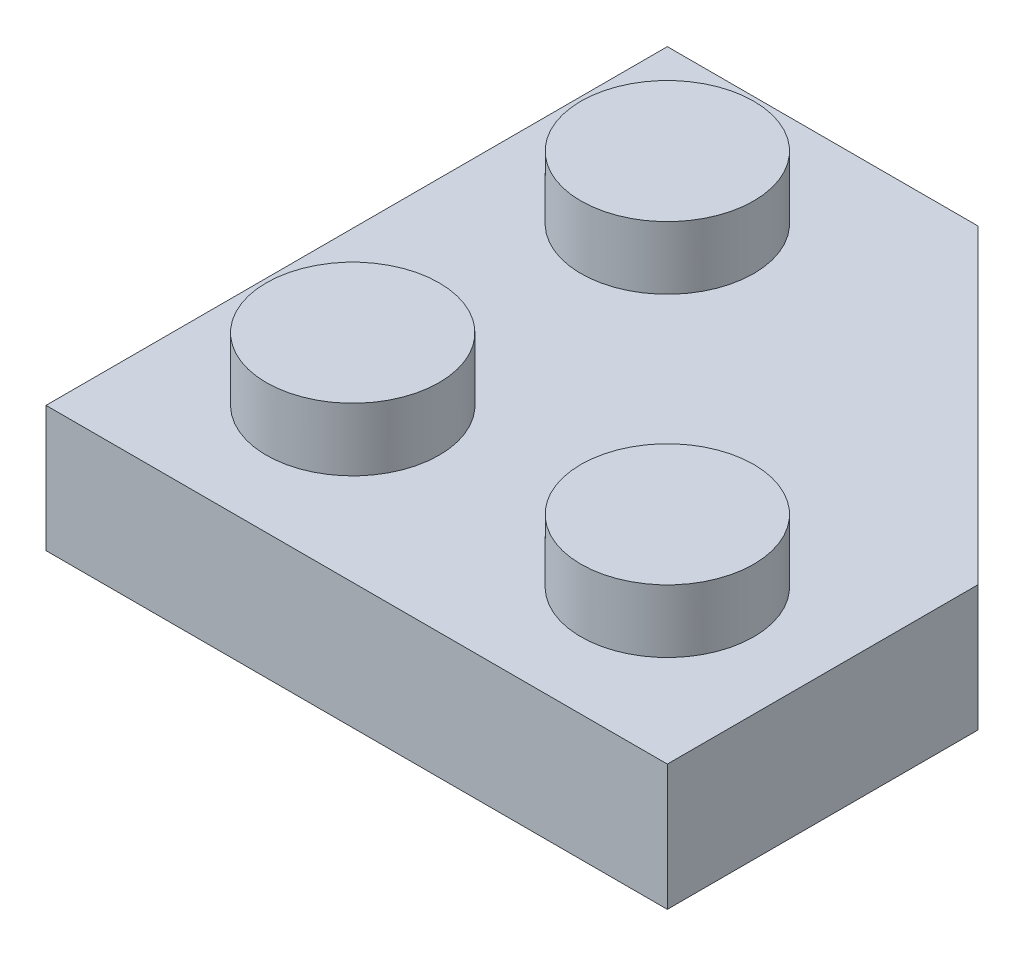
ISO-10303-21;
HEADER;
FILE_DESCRIPTION(('STEP AP214'),'2;1');
FILE_NAME('part.step','',(''),(''),'','','');
FILE_SCHEMA(('AUTOMOTIVE_DESIGN { 1 0 10303 214 1 1 1 1 }'));
ENDSEC;
DATA;
#1=APPLICATION_CONTEXT('core data for automotive mechanical design processes');
#2=APPLICATION_PROTOCOL_DEFINITION('international standard','automotive_design',2000,#1);
#3=PRODUCT_CONTEXT('',#1,'mechanical');
#4=PRODUCT('Part','Part','',(#3));
#5=PRODUCT_RELATED_PRODUCT_CATEGORY('part','',(#4));
#6=PRODUCT_DEFINITION_FORMATION('','',#4);
#7=PRODUCT_DEFINITION_CONTEXT('part definition',#1,'design');
#8=PRODUCT_DEFINITION('design','',#6,#7);
#9=PRODUCT_DEFINITION_SHAPE('','',#8);
#10=(LENGTH_UNIT() NAMED_UNIT(*) SI_UNIT(.MILLI.,.METRE.));
#11=(NAMED_UNIT(*) PLANE_ANGLE_UNIT() SI_UNIT($,.RADIAN.));
#12=(NAMED_UNIT(*) SI_UNIT($,.STERADIAN.) SOLID_ANGLE_UNIT());
#13=UNCERTAINTY_MEASURE_WITH_UNIT(LENGTH_MEASURE(1.E-05),#10,'distance_accuracy_value','');
#14=(GEOMETRIC_REPRESENTATION_CONTEXT(3) GLOBAL_UNCERTAINTY_ASSIGNED_CONTEXT((#13)) GLOBAL_UNIT_ASSIGNED_CONTEXT((#10,
#11,#12)) REPRESENTATION_CONTEXT('',''));
#15=CARTESIAN_POINT('',(0.,0.,0.));
#16=DIRECTION('',(0.,0.,1.));
#17=DIRECTION('',(1.,0.,0.));
#18=AXIS2_PLACEMENT_3D('',#15,#16,#17);
#19=CARTESIAN_POINT('',(-12.4847290640394,0.,7.9));
#20=DIRECTION('',(0.,1.,0.));
#21=DIRECTION('',(0.,0.,1.));
#22=AXIS2_PLACEMENT_3D('',#19,#20,#21);
#23=PLANE('',#22);
#24=DIRECTION('',(1.,0.,0.));
#25=VECTOR('',#24,1.);
#26=CARTESIAN_POINT('',(-12.4847290640394,0.,-7.9));
#27=LINE('',#26,#25);
#28=CARTESIAN_POINT('',(-12.4847290640394,0.,-7.9));
#29=VERTEX_POINT('',#28);
#30=CARTESIAN_POINT('',(-4.58472906403942,0.,-7.9));
#31=VERTEX_POINT('',#30);
#32=EDGE_CURVE('E417',#29,#31,#27,.T.);
#33=ORIENTED_EDGE('',*,*,#32,.T.);
#34=DIRECTION('',(0.707106781186547,0.,0.707106781186547));
#35=VECTOR('',#34,1.);
#36=CARTESIAN_POINT('',(3.31527093596058,0.,0.));
#37=LINE('',#36,#35);
#38=CARTESIAN_POINT('',(-3.38472906403942,0.,-6.7));
#39=VERTEX_POINT('',#38);
#40=EDGE_CURVE('E142',#31,#39,#37,.T.);
#41=ORIENTED_EDGE('',*,*,#40,.T.);
#42=DIRECTION('',(1.,0.,0.));
#43=VECTOR('',#42,1.);
#44=CARTESIAN_POINT('',(-12.4847290640394,0.,-6.7));
#45=LINE('',#44,#43);
#46=CARTESIAN_POINT('',(-11.2847290640394,0.,-6.7));
#47=VERTEX_POINT('',#46);
#48=EDGE_CURVE('E442',#47,#39,#45,.T.);
#49=ORIENTED_EDGE('',*,*,#48,.F.);
#50=DIRECTION('',(0.,0.,-1.));
#51=VECTOR('',#50,1.);
#52=CARTESIAN_POINT('',(-11.2847290640394,0.,7.9));
#53=LINE('',#52,#51);
#54=CARTESIAN_POINT('',(-11.2847290640394,0.,6.7));
#55=VERTEX_POINT('',#54);
#56=EDGE_CURVE('E454',#55,#47,#53,.T.);
#57=ORIENTED_EDGE('',*,*,#56,.F.);
#58=DIRECTION('',(1.,0.,0.));
#59=VECTOR('',#58,1.);
#60=CARTESIAN_POINT('',(-12.4847290640394,0.,6.7));
#61=LINE('',#60,#59);
#62=CARTESIAN_POINT('',(2.11527093596058,0.,6.7));
#63=VERTEX_POINT('',#62);
#64=EDGE_CURVE('E436',#55,#63,#61,.T.);
#65=ORIENTED_EDGE('',*,*,#64,.T.);
#66=DIRECTION('',(0.,0.,-1.));
#67=VECTOR('',#66,1.);
#68=CARTESIAN_POINT('',(2.11527093596058,0.,7.9));
#69=LINE('',#68,#67);
#70=CARTESIAN_POINT('',(2.11527093596058,0.,-1.2));
#71=VERTEX_POINT('',#70);
#72=EDGE_CURVE('E149',#63,#71,#69,.T.);
#73=ORIENTED_EDGE('',*,*,#72,.T.);
#74=CARTESIAN_POINT('',(3.31527093596058,0.,0.));
#75=VERTEX_POINT('',#74);
#76=EDGE_CURVE('E133',#71,#75,#37,.T.);
#77=ORIENTED_EDGE('',*,*,#76,.T.);
#78=DIRECTION('',(0.,0.,-1.));
#79=VECTOR('',#78,1.);
#80=CARTESIAN_POINT('',(3.31527093596058,0.,7.9));
#81=LINE('',#80,#79);
#82=CARTESIAN_POINT('',(3.31527093596058,0.,7.9));
#83=VERTEX_POINT('',#82);
#84=EDGE_CURVE('E146',#83,#75,#81,.T.);
#85=ORIENTED_EDGE('',*,*,#84,.F.);
#86=DIRECTION('',(1.,0.,0.));
#87=VECTOR('',#86,1.);
#88=CARTESIAN_POINT('',(-12.4847290640394,0.,7.9));
#89=LINE('',#88,#87);
#90=CARTESIAN_POINT('',(-12.4847290640394,0.,7.9));
#91=VERTEX_POINT('',#90);
#92=EDGE_CURVE('E90',#91,#83,#89,.T.);
#93=ORIENTED_EDGE('',*,*,#92,.F.);
#94=DIRECTION('',(0.,0.,-1.));
#95=VECTOR('',#94,1.);
#96=CARTESIAN_POINT('',(-12.4847290640394,0.,7.9));
#97=LINE('',#96,#95);
#98=EDGE_CURVE('E153',#91,#29,#97,.T.);
#99=ORIENTED_EDGE('',*,*,#98,.T.);
#100=EDGE_LOOP('',(#33,#41,#49,#57,#65,#73,#77,#85,#93,#99));
#101=FACE_BOUND('',#100,.T.);
#102=ADVANCED_FACE('F43',(#101),#23,.F.);
#103=CARTESIAN_POINT('',(-0.584729064039415,4.8,4.));
#104=DIRECTION('',(0.,1.,0.));
#105=DIRECTION('',(-1.,0.,0.));
#106=AXIS2_PLACEMENT_3D('',#103,#104,#105);
#107=PLANE('',#106);
#108=CARTESIAN_POINT('',(-0.584729064039415,4.8,4.));
#109=DIRECTION('',(0.,1.,0.));
#110=DIRECTION('',(-1.,0.,0.));
#111=AXIS2_PLACEMENT_3D('',#108,#109,#110);
#112=CIRCLE('',#111,2.19793866498286);
#113=CARTESIAN_POINT('',(-2.78266772902228,4.8,4.));
#114=VERTEX_POINT('',#113);
#115=EDGE_CURVE('E51',#114,#114,#112,.T.);
#116=ORIENTED_EDGE('',*,*,#115,.T.);
#117=EDGE_LOOP('',(#116));
#118=FACE_BOUND('',#117,.T.);
#119=ADVANCED_FACE('F45',(#118),#107,.T.);
#120=CARTESIAN_POINT('',(-0.584729064039415,4.8,4.));
#121=DIRECTION('',(0.,-1.,0.));
#122=DIRECTION('',(1.,0.,0.));
#123=AXIS2_PLACEMENT_3D('',#120,#121,#122);
#124=CYLINDRICAL_SURFACE('',#123,2.19793866498286);
#125=ORIENTED_EDGE('',*,*,#115,.F.);
#126=EDGE_LOOP('',(#125));
#127=FACE_BOUND('',#126,.T.);
#128=CARTESIAN_POINT('',(-0.584729064039415,3.2,4.));
#129=DIRECTION('',(0.,-1.,0.));
#130=DIRECTION('',(1.,0.,0.));
#131=AXIS2_PLACEMENT_3D('',#128,#129,#130);
#132=CIRCLE('',#131,2.19793866498286);
#133=CARTESIAN_POINT('',(1.61320960094345,3.2,4.));
#134=VERTEX_POINT('',#133);
#135=EDGE_CURVE('E170',#134,#134,#132,.F.);
#136=ORIENTED_EDGE('',*,*,#135,.T.);
#137=EDGE_LOOP('',(#136));
#138=FACE_BOUND('',#137,.T.);
#139=ADVANCED_FACE('F176',(#127,#138),#124,.T.);
#140=CARTESIAN_POINT('',(-8.58472906403941,4.8,4.));
#141=DIRECTION('',(0.,1.,0.));
#142=DIRECTION('',(-1.,0.,0.));
#143=AXIS2_PLACEMENT_3D('',#140,#141,#142);
#144=PLANE('',#143);
#145=CARTESIAN_POINT('',(-8.58472906403941,4.8,4.));
#146=DIRECTION('',(0.,1.,0.));
#147=DIRECTION('',(-1.,0.,0.));
#148=AXIS2_PLACEMENT_3D('',#145,#146,#147);
#149=CIRCLE('',#148,2.19793866498286);
#150=CARTESIAN_POINT('',(-10.7826677290223,4.8,4.));
#151=VERTEX_POINT('',#150);
#152=EDGE_CURVE('E167',#151,#151,#149,.T.);
#153=ORIENTED_EDGE('',*,*,#152,.T.);
#154=EDGE_LOOP('',(#153));
#155=FACE_BOUND('',#154,.T.);
#156=ADVANCED_FACE('F179',(#155),#144,.T.);
#157=CARTESIAN_POINT('',(-8.58472906403941,4.8,4.));
#158=DIRECTION('',(0.,-1.,0.));
#159=DIRECTION('',(1.,0.,0.));
#160=AXIS2_PLACEMENT_3D('',#157,#158,#159);
#161=CYLINDRICAL_SURFACE('',#160,2.19793866498286);
#162=ORIENTED_EDGE('',*,*,#152,.F.);
#163=EDGE_LOOP('',(#162));
#164=FACE_BOUND('',#163,.T.);
#165=CARTESIAN_POINT('',(-8.58472906403941,3.2,4.));
#166=DIRECTION('',(0.,-1.,0.));
#167=DIRECTION('',(1.,0.,0.));
#168=AXIS2_PLACEMENT_3D('',#165,#166,#167);
#169=CIRCLE('',#168,2.19793866498286);
#170=CARTESIAN_POINT('',(-6.38679039905655,3.2,4.));
#171=VERTEX_POINT('',#170);
#172=EDGE_CURVE('E164',#171,#171,#169,.F.);
#173=ORIENTED_EDGE('',*,*,#172,.T.);
#174=EDGE_LOOP('',(#173));
#175=FACE_BOUND('',#174,.T.);
#176=ADVANCED_FACE('F207',(#164,#175),#161,.T.);
#177=CARTESIAN_POINT('',(-12.4847290640394,3.2,7.9));
#178=DIRECTION('',(1.,0.,0.));
#179=DIRECTION('',(0.,0.,-1.));
#180=AXIS2_PLACEMENT_3D('',#177,#178,#179);
#181=PLANE('',#180);
#182=DIRECTION('',(0.,-1.,0.));
#183=VECTOR('',#182,1.);
#184=CARTESIAN_POINT('',(-12.4847290640394,3.2,-7.9));
#185=LINE('',#184,#183);
#186=CARTESIAN_POINT('',(-12.4847290640394,3.2,-7.9));
#187=VERTEX_POINT('',#186);
#188=EDGE_CURVE('E415',#187,#29,#185,.T.);
#189=ORIENTED_EDGE('',*,*,#188,.T.);
#190=ORIENTED_EDGE('',*,*,#98,.F.);
#191=DIRECTION('',(0.,-1.,0.));
#192=VECTOR('',#191,1.);
#193=CARTESIAN_POINT('',(-12.4847290640394,3.2,7.9));
#194=LINE('',#193,#192);
#195=CARTESIAN_POINT('',(-12.4847290640394,3.2,7.9));
#196=VERTEX_POINT('',#195);
#197=EDGE_CURVE('E416',#196,#91,#194,.T.);
#198=ORIENTED_EDGE('',*,*,#197,.F.);
#199=DIRECTION('',(0.,0.,-1.));
#200=VECTOR('',#199,1.);
#201=CARTESIAN_POINT('',(-12.4847290640394,3.2,7.9));
#202=LINE('',#201,#200);
#203=EDGE_CURVE('E158',#196,#187,#202,.T.);
#204=ORIENTED_EDGE('',*,*,#203,.T.);
#205=EDGE_LOOP('',(#189,#190,#198,#204));
#206=FACE_BOUND('',#205,.T.);
#207=ADVANCED_FACE('F194',(#206),#181,.F.);
#208=CARTESIAN_POINT('',(3.31527093596058,0.,7.9));
#209=DIRECTION('',(-1.,0.,0.));
#210=DIRECTION('',(0.,0.,1.));
#211=AXIS2_PLACEMENT_3D('',#208,#209,#210);
#212=PLANE('',#211);
#213=ORIENTED_EDGE('',*,*,#84,.T.);
#214=DIRECTION('',(0.,1.,0.));
#215=VECTOR('',#214,1.);
#216=CARTESIAN_POINT('',(3.31527093596058,0.,0.));
#217=LINE('',#216,#215);
#218=CARTESIAN_POINT('',(3.31527093596058,3.2,0.));
#219=VERTEX_POINT('',#218);
#220=EDGE_CURVE('E129',#75,#219,#217,.T.);
#221=ORIENTED_EDGE('',*,*,#220,.T.);
#222=DIRECTION('',(0.,0.,-1.));
#223=VECTOR('',#222,1.);
#224=CARTESIAN_POINT('',(3.31527093596058,3.2,7.9));
#225=LINE('',#224,#223);
#226=CARTESIAN_POINT('',(3.31527093596058,3.2,7.9));
#227=VERTEX_POINT('',#226);
#228=EDGE_CURVE('E154',#227,#219,#225,.T.);
#229=ORIENTED_EDGE('',*,*,#228,.F.);
#230=DIRECTION('',(0.,1.,0.));
#231=VECTOR('',#230,1.);
#232=CARTESIAN_POINT('',(3.31527093596058,0.,7.9));
#233=LINE('',#232,#231);
#234=EDGE_CURVE('E152',#83,#227,#233,.T.);
#235=ORIENTED_EDGE('',*,*,#234,.F.);
#236=EDGE_LOOP('',(#213,#221,#229,#235));
#237=FACE_BOUND('',#236,.T.);
#238=ADVANCED_FACE('F151',(#237),#212,.F.);
#239=CARTESIAN_POINT('',(3.31527093596058,3.2,7.9));
#240=DIRECTION('',(0.,-1.,0.));
#241=DIRECTION('',(1.,0.,0.));
#242=AXIS2_PLACEMENT_3D('',#239,#240,#241);
#243=PLANE('',#242);
#244=ORIENTED_EDGE('',*,*,#228,.T.);
#245=DIRECTION('',(0.707106781186547,0.,0.707106781186547));
#246=VECTOR('',#245,1.);
#247=CARTESIAN_POINT('',(3.31527093596058,3.2,0.));
#248=LINE('',#247,#246);
#249=CARTESIAN_POINT('',(-4.58472906403942,3.2,-7.9));
#250=VERTEX_POINT('',#249);
#251=EDGE_CURVE('E136',#250,#219,#248,.T.);
#252=ORIENTED_EDGE('',*,*,#251,.F.);
#253=DIRECTION('',(-1.,0.,0.));
#254=VECTOR('',#253,1.);
#255=CARTESIAN_POINT('',(3.31527093596058,3.2,-7.9));
#256=LINE('',#255,#254);
#257=EDGE_CURVE('E82',#250,#187,#256,.T.);
#258=ORIENTED_EDGE('',*,*,#257,.T.);
#259=ORIENTED_EDGE('',*,*,#203,.F.);
#260=DIRECTION('',(-1.,0.,0.));
#261=VECTOR('',#260,1.);
#262=CARTESIAN_POINT('',(3.31527093596058,3.2,7.9));
#263=LINE('',#262,#261);
#264=EDGE_CURVE('E67',#227,#196,#263,.T.);
#265=ORIENTED_EDGE('',*,*,#264,.F.);
#266=EDGE_LOOP('',(#244,#252,#258,#259,#265));
#267=FACE_BOUND('',#266,.T.);
#268=CARTESIAN_POINT('',(-8.58472906403941,3.2,-4.));
#269=DIRECTION('',(0.,-1.,0.));
#270=DIRECTION('',(1.,0.,0.));
#271=AXIS2_PLACEMENT_3D('',#268,#269,#270);
#272=CIRCLE('',#271,2.19793866498286);
#273=CARTESIAN_POINT('',(-6.38679039905655,3.2,-4.));
#274=VERTEX_POINT('',#273);
#275=EDGE_CURVE('E156',#274,#274,#272,.F.);
#276=ORIENTED_EDGE('',*,*,#275,.F.);
#277=EDGE_LOOP('',(#276));
#278=FACE_BOUND('',#277,.T.);
#279=ORIENTED_EDGE('',*,*,#172,.F.);
#280=EDGE_LOOP('',(#279));
#281=FACE_BOUND('',#280,.T.);
#282=ORIENTED_EDGE('',*,*,#135,.F.);
#283=EDGE_LOOP('',(#282));
#284=FACE_BOUND('',#283,.T.);
#285=ADVANCED_FACE('F182',(#267,#278,#281,#284),#243,.F.);
#286=CARTESIAN_POINT('',(0.,0.,7.9));
#287=DIRECTION('',(0.,0.,1.));
#288=DIRECTION('',(1.,0.,0.));
#289=AXIS2_PLACEMENT_3D('',#286,#287,#288);
#290=PLANE('',#289);
#291=ORIENTED_EDGE('',*,*,#197,.T.);
#292=ORIENTED_EDGE('',*,*,#92,.T.);
#293=ORIENTED_EDGE('',*,*,#234,.T.);
#294=ORIENTED_EDGE('',*,*,#264,.T.);
#295=EDGE_LOOP('',(#291,#292,#293,#294));
#296=FACE_BOUND('',#295,.T.);
#297=ADVANCED_FACE('F184',(#296),#290,.T.);
#298=CARTESIAN_POINT('',(0.,0.,-7.9));
#299=DIRECTION('',(0.,0.,1.));
#300=DIRECTION('',(1.,0.,0.));
#301=AXIS2_PLACEMENT_3D('',#298,#299,#300);
#302=PLANE('',#301);
#303=ORIENTED_EDGE('',*,*,#257,.F.);
#304=DIRECTION('',(0.,1.,0.));
#305=VECTOR('',#304,1.);
#306=CARTESIAN_POINT('',(-4.58472906403942,0.,-7.9));
#307=LINE('',#306,#305);
#308=EDGE_CURVE('E141',#31,#250,#307,.T.);
#309=ORIENTED_EDGE('',*,*,#308,.F.);
#310=ORIENTED_EDGE('',*,*,#32,.F.);
#311=ORIENTED_EDGE('',*,*,#188,.F.);
#312=EDGE_LOOP('',(#303,#309,#310,#311));
#313=FACE_BOUND('',#312,.T.);
#314=ADVANCED_FACE('F191',(#313),#302,.F.);
#315=CARTESIAN_POINT('',(-8.58472906403941,4.8,-4.));
#316=DIRECTION('',(0.,-1.,0.));
#317=DIRECTION('',(1.,0.,0.));
#318=AXIS2_PLACEMENT_3D('',#315,#316,#317);
#319=CYLINDRICAL_SURFACE('',#318,2.19793866498286);
#320=CARTESIAN_POINT('',(-8.58472906403941,4.8,-4.));
#321=DIRECTION('',(0.,1.,0.));
#322=DIRECTION('',(-1.,0.,0.));
#323=AXIS2_PLACEMENT_3D('',#320,#321,#322);
#324=CIRCLE('',#323,2.19793866498286);
#325=CARTESIAN_POINT('',(-10.7826677290223,4.8,-4.));
#326=VERTEX_POINT('',#325);
#327=EDGE_CURVE('E426',#326,#326,#324,.T.);
#328=ORIENTED_EDGE('',*,*,#327,.F.);
#329=EDGE_LOOP('',(#328));
#330=FACE_BOUND('',#329,.T.);
#331=ORIENTED_EDGE('',*,*,#275,.T.);
#332=EDGE_LOOP('',(#331));
#333=FACE_BOUND('',#332,.T.);
#334=ADVANCED_FACE('F407',(#330,#333),#319,.T.);
#335=CARTESIAN_POINT('',(-8.58472906403941,4.8,-4.));
#336=DIRECTION('',(0.,1.,0.));
#337=DIRECTION('',(-1.,0.,0.));
#338=AXIS2_PLACEMENT_3D('',#335,#336,#337);
#339=PLANE('',#338);
#340=ORIENTED_EDGE('',*,*,#327,.T.);
#341=EDGE_LOOP('',(#340));
#342=FACE_BOUND('',#341,.T.);
#343=ADVANCED_FACE('F237',(#342),#339,.T.);
#344=CARTESIAN_POINT('',(-0.584729064039415,3.6,4.));
#345=DIRECTION('',(0.,1.,0.));
#346=DIRECTION('',(-1.,0.,0.));
#347=AXIS2_PLACEMENT_3D('',#344,#345,#346);
#348=PLANE('',#347);
#349=CARTESIAN_POINT('',(-0.584729064039415,3.6,4.));
#350=DIRECTION('',(0.,1.,0.));
#351=DIRECTION('',(-1.,0.,0.));
#352=AXIS2_PLACEMENT_3D('',#349,#350,#351);
#353=CIRCLE('',#352,0.997938664982861);
#354=CARTESIAN_POINT('',(-1.58266772902228,3.6,4.));
#355=VERTEX_POINT('',#354);
#356=EDGE_CURVE('E429',#355,#355,#353,.T.);
#357=ORIENTED_EDGE('',*,*,#356,.F.);
#358=EDGE_LOOP('',(#357));
#359=FACE_BOUND('',#358,.T.);
#360=ADVANCED_FACE('F232',(#359),#348,.F.);
#361=CARTESIAN_POINT('',(-0.584729064039415,4.8,4.));
#362=DIRECTION('',(0.,-1.,0.));
#363=DIRECTION('',(1.,0.,0.));
#364=AXIS2_PLACEMENT_3D('',#361,#362,#363);
#365=CYLINDRICAL_SURFACE('',#364,0.997938664982861);
#366=ORIENTED_EDGE('',*,*,#356,.T.);
#367=EDGE_LOOP('',(#366));
#368=FACE_BOUND('',#367,.T.);
#369=CARTESIAN_POINT('',(-0.584729064039415,2.,4.));
#370=DIRECTION('',(0.,-1.,0.));
#371=DIRECTION('',(1.,0.,0.));
#372=AXIS2_PLACEMENT_3D('',#369,#370,#371);
#373=CIRCLE('',#372,0.997938664982861);
#374=CARTESIAN_POINT('',(0.413209600943446,2.,4.));
#375=VERTEX_POINT('',#374);
#376=EDGE_CURVE('E433',#375,#375,#373,.F.);
#377=ORIENTED_EDGE('',*,*,#376,.F.);
#378=EDGE_LOOP('',(#377));
#379=FACE_BOUND('',#378,.T.);
#380=ADVANCED_FACE('F236',(#368,#379),#365,.F.);
#381=CARTESIAN_POINT('',(-8.58472906403941,3.6,4.));
#382=DIRECTION('',(0.,1.,0.));
#383=DIRECTION('',(-1.,0.,0.));
#384=AXIS2_PLACEMENT_3D('',#381,#382,#383);
#385=PLANE('',#384);
#386=CARTESIAN_POINT('',(-8.58472906403941,3.6,4.));
#387=DIRECTION('',(0.,1.,0.));
#388=DIRECTION('',(-1.,0.,0.));
#389=AXIS2_PLACEMENT_3D('',#386,#387,#388);
#390=CIRCLE('',#389,0.997938664982861);
#391=CARTESIAN_POINT('',(-9.58266772902228,3.6,4.));
#392=VERTEX_POINT('',#391);
#393=EDGE_CURVE('E470',#392,#392,#390,.T.);
#394=ORIENTED_EDGE('',*,*,#393,.F.);
#395=EDGE_LOOP('',(#394));
#396=FACE_BOUND('',#395,.T.);
#397=ADVANCED_FACE('F246',(#396),#385,.F.);
#398=CARTESIAN_POINT('',(-8.58472906403941,4.8,4.));
#399=DIRECTION('',(0.,-1.,0.));
#400=DIRECTION('',(1.,0.,0.));
#401=AXIS2_PLACEMENT_3D('',#398,#399,#400);
#402=CYLINDRICAL_SURFACE('',#401,0.997938664982861);
#403=ORIENTED_EDGE('',*,*,#393,.T.);
#404=EDGE_LOOP('',(#403));
#405=FACE_BOUND('',#404,.T.);
#406=CARTESIAN_POINT('',(-8.58472906403941,2.,4.));
#407=DIRECTION('',(0.,-1.,0.));
#408=DIRECTION('',(1.,0.,0.));
#409=AXIS2_PLACEMENT_3D('',#406,#407,#408);
#410=CIRCLE('',#409,0.997938664982861);
#411=CARTESIAN_POINT('',(-7.58679039905655,2.,4.));
#412=VERTEX_POINT('',#411);
#413=EDGE_CURVE('E467',#412,#412,#410,.F.);
#414=ORIENTED_EDGE('',*,*,#413,.F.);
#415=EDGE_LOOP('',(#414));
#416=FACE_BOUND('',#415,.T.);
#417=ADVANCED_FACE('F255',(#405,#416),#402,.F.);
#418=CARTESIAN_POINT('',(-11.2847290640394,3.2,7.9));
#419=DIRECTION('',(1.,0.,0.));
#420=DIRECTION('',(0.,0.,-1.));
#421=AXIS2_PLACEMENT_3D('',#418,#419,#420);
#422=PLANE('',#421);
#423=DIRECTION('',(0.,-1.,0.));
#424=VECTOR('',#423,1.);
#425=CARTESIAN_POINT('',(-11.2847290640394,3.2,-6.7));
#426=LINE('',#425,#424);
#427=CARTESIAN_POINT('',(-11.2847290640394,2.,-6.7));
#428=VERTEX_POINT('',#427);
#429=EDGE_CURVE('E447',#428,#47,#426,.T.);
#430=ORIENTED_EDGE('',*,*,#429,.F.);
#431=DIRECTION('',(0.,0.,-1.));
#432=VECTOR('',#431,1.);
#433=CARTESIAN_POINT('',(-11.2847290640394,2.,7.9));
#434=LINE('',#433,#432);
#435=CARTESIAN_POINT('',(-11.2847290640394,2.,6.7));
#436=VERTEX_POINT('',#435);
#437=EDGE_CURVE('E459',#436,#428,#434,.T.);
#438=ORIENTED_EDGE('',*,*,#437,.F.);
#439=DIRECTION('',(0.,-1.,0.));
#440=VECTOR('',#439,1.);
#441=CARTESIAN_POINT('',(-11.2847290640394,3.2,6.7));
#442=LINE('',#441,#440);
#443=EDGE_CURVE('E58',#436,#55,#442,.T.);
#444=ORIENTED_EDGE('',*,*,#443,.T.);
#445=ORIENTED_EDGE('',*,*,#56,.T.);
#446=EDGE_LOOP('',(#430,#438,#444,#445));
#447=FACE_BOUND('',#446,.T.);
#448=ADVANCED_FACE('F264',(#447),#422,.T.);
#449=CARTESIAN_POINT('',(2.11527093596058,0.,7.9));
#450=DIRECTION('',(-1.,0.,0.));
#451=DIRECTION('',(0.,0.,1.));
#452=AXIS2_PLACEMENT_3D('',#449,#450,#451);
#453=PLANE('',#452);
#454=DIRECTION('',(0.,1.,0.));
#455=VECTOR('',#454,1.);
#456=CARTESIAN_POINT('',(2.11527093596058,0.,-1.2));
#457=LINE('',#456,#455);
#458=CARTESIAN_POINT('',(2.11527093596058,2.,-1.2));
#459=VERTEX_POINT('',#458);
#460=EDGE_CURVE('E503',#71,#459,#457,.T.);
#461=ORIENTED_EDGE('',*,*,#460,.F.);
#462=ORIENTED_EDGE('',*,*,#72,.F.);
#463=DIRECTION('',(0.,1.,0.));
#464=VECTOR('',#463,1.);
#465=CARTESIAN_POINT('',(2.11527093596058,0.,6.7));
#466=LINE('',#465,#464);
#467=CARTESIAN_POINT('',(2.11527093596058,2.,6.7));
#468=VERTEX_POINT('',#467);
#469=EDGE_CURVE('E474',#63,#468,#466,.T.);
#470=ORIENTED_EDGE('',*,*,#469,.T.);
#471=DIRECTION('',(0.,0.,-1.));
#472=VECTOR('',#471,1.);
#473=CARTESIAN_POINT('',(2.11527093596058,2.,7.9));
#474=LINE('',#473,#472);
#475=EDGE_CURVE('E456',#468,#459,#474,.T.);
#476=ORIENTED_EDGE('',*,*,#475,.T.);
#477=EDGE_LOOP('',(#461,#462,#470,#476));
#478=FACE_BOUND('',#477,.T.);
#479=ADVANCED_FACE('F273',(#478),#453,.T.);
#480=CARTESIAN_POINT('',(3.31527093596058,2.,7.9));
#481=DIRECTION('',(0.,-1.,0.));
#482=DIRECTION('',(1.,0.,0.));
#483=AXIS2_PLACEMENT_3D('',#480,#481,#482);
#484=PLANE('',#483);
#485=DIRECTION('',(-0.707106781186548,0.,-0.707106781186548));
#486=VECTOR('',#485,1.);
#487=CARTESIAN_POINT('',(7.26527093596058,2.,3.95));
#488=LINE('',#487,#486);
#489=CARTESIAN_POINT('',(-3.38472906403942,2.,-6.7));
#490=VERTEX_POINT('',#489);
#491=EDGE_CURVE('E502',#459,#490,#488,.T.);
#492=ORIENTED_EDGE('',*,*,#491,.F.);
#493=ORIENTED_EDGE('',*,*,#475,.F.);
#494=DIRECTION('',(-1.,0.,0.));
#495=VECTOR('',#494,1.);
#496=CARTESIAN_POINT('',(3.31527093596058,2.,6.7));
#497=LINE('',#496,#495);
#498=EDGE_CURVE('E463',#468,#436,#497,.T.);
#499=ORIENTED_EDGE('',*,*,#498,.T.);
#500=ORIENTED_EDGE('',*,*,#437,.T.);
#501=DIRECTION('',(-1.,0.,0.));
#502=VECTOR('',#501,1.);
#503=CARTESIAN_POINT('',(3.31527093596058,2.,-6.7));
#504=LINE('',#503,#502);
#505=EDGE_CURVE('E448',#490,#428,#504,.T.);
#506=ORIENTED_EDGE('',*,*,#505,.F.);
#507=EDGE_LOOP('',(#492,#493,#499,#500,#506));
#508=FACE_BOUND('',#507,.T.);
#509=CARTESIAN_POINT('',(-4.58472906403942,2.,0.));
#510=DIRECTION('',(0.,-1.,0.));
#511=DIRECTION('',(1.,0.,0.));
#512=AXIS2_PLACEMENT_3D('',#509,#510,#511);
#513=CIRCLE('',#512,3.25);
#514=CARTESIAN_POINT('',(-1.33472906403942,2.,0.));
#515=VERTEX_POINT('',#514);
#516=EDGE_CURVE('E479',#515,#515,#513,.T.);
#517=ORIENTED_EDGE('',*,*,#516,.F.);
#518=EDGE_LOOP('',(#517));
#519=FACE_BOUND('',#518,.T.);
#520=CARTESIAN_POINT('',(-8.58472906403941,2.,-4.));
#521=DIRECTION('',(0.,-1.,0.));
#522=DIRECTION('',(1.,0.,0.));
#523=AXIS2_PLACEMENT_3D('',#520,#521,#522);
#524=CIRCLE('',#523,0.997938664982861);
#525=CARTESIAN_POINT('',(-7.58679039905655,2.,-4.));
#526=VERTEX_POINT('',#525);
#527=EDGE_CURVE('E457',#526,#526,#524,.F.);
#528=ORIENTED_EDGE('',*,*,#527,.T.);
#529=EDGE_LOOP('',(#528));
#530=FACE_BOUND('',#529,.T.);
#531=ORIENTED_EDGE('',*,*,#413,.T.);
#532=EDGE_LOOP('',(#531));
#533=FACE_BOUND('',#532,.T.);
#534=ORIENTED_EDGE('',*,*,#376,.T.);
#535=EDGE_LOOP('',(#534));
#536=FACE_BOUND('',#535,.T.);
#537=ADVANCED_FACE('F284',(#508,#519,#530,#533,#536),#484,.T.);
#538=CARTESIAN_POINT('',(0.,0.,6.7));
#539=DIRECTION('',(0.,0.,1.));
#540=DIRECTION('',(1.,0.,0.));
#541=AXIS2_PLACEMENT_3D('',#538,#539,#540);
#542=PLANE('',#541);
#543=ORIENTED_EDGE('',*,*,#443,.F.);
#544=ORIENTED_EDGE('',*,*,#498,.F.);
#545=ORIENTED_EDGE('',*,*,#469,.F.);
#546=ORIENTED_EDGE('',*,*,#64,.F.);
#547=EDGE_LOOP('',(#543,#544,#545,#546));
#548=FACE_BOUND('',#547,.T.);
#549=ADVANCED_FACE('F279',(#548),#542,.F.);
#550=CARTESIAN_POINT('',(0.,0.,-6.7));
#551=DIRECTION('',(0.,0.,1.));
#552=DIRECTION('',(1.,0.,0.));
#553=AXIS2_PLACEMENT_3D('',#550,#551,#552);
#554=PLANE('',#553);
#555=DIRECTION('',(0.,-1.,0.));
#556=VECTOR('',#555,1.);
#557=CARTESIAN_POINT('',(-3.38472906403942,0.,-6.7));
#558=LINE('',#557,#556);
#559=EDGE_CURVE('E444',#490,#39,#558,.T.);
#560=ORIENTED_EDGE('',*,*,#559,.F.);
#561=ORIENTED_EDGE('',*,*,#505,.T.);
#562=ORIENTED_EDGE('',*,*,#429,.T.);
#563=ORIENTED_EDGE('',*,*,#48,.T.);
#564=EDGE_LOOP('',(#560,#561,#562,#563));
#565=FACE_BOUND('',#564,.T.);
#566=ADVANCED_FACE('F283',(#565),#554,.T.);
#567=CARTESIAN_POINT('',(-8.58472906403941,4.8,-4.));
#568=DIRECTION('',(0.,-1.,0.));
#569=DIRECTION('',(1.,0.,0.));
#570=AXIS2_PLACEMENT_3D('',#567,#568,#569);
#571=CYLINDRICAL_SURFACE('',#570,0.997938664982861);
#572=CARTESIAN_POINT('',(-8.58472906403941,3.6,-4.));
#573=DIRECTION('',(0.,1.,0.));
#574=DIRECTION('',(-1.,0.,0.));
#575=AXIS2_PLACEMENT_3D('',#572,#573,#574);
#576=CIRCLE('',#575,0.997938664982861);
#577=CARTESIAN_POINT('',(-9.58266772902228,3.6,-4.));
#578=VERTEX_POINT('',#577);
#579=EDGE_CURVE('E451',#578,#578,#576,.T.);
#580=ORIENTED_EDGE('',*,*,#579,.T.);
#581=EDGE_LOOP('',(#580));
#582=FACE_BOUND('',#581,.T.);
#583=ORIENTED_EDGE('',*,*,#527,.F.);
#584=EDGE_LOOP('',(#583));
#585=FACE_BOUND('',#584,.T.);
#586=ADVANCED_FACE('F292',(#582,#585),#571,.F.);
#587=CARTESIAN_POINT('',(-8.58472906403941,3.6,-4.));
#588=DIRECTION('',(0.,1.,0.));
#589=DIRECTION('',(-1.,0.,0.));
#590=AXIS2_PLACEMENT_3D('',#587,#588,#589);
#591=PLANE('',#590);
#592=ORIENTED_EDGE('',*,*,#579,.F.);
#593=EDGE_LOOP('',(#592));
#594=FACE_BOUND('',#593,.T.);
#595=ADVANCED_FACE('F296',(#594),#591,.F.);
#596=CARTESIAN_POINT('',(-4.58472906403941,-9.19238815542511,0.));
#597=DIRECTION('',(0.,1.,0.));
#598=DIRECTION('',(-1.,0.,0.));
#599=AXIS2_PLACEMENT_3D('',#596,#597,#598);
#600=CYLINDRICAL_SURFACE('',#599,3.25);
#601=CARTESIAN_POINT('',(-4.58472906403942,0.200000000000001,0.));
#602=DIRECTION('',(0.,1.,0.));
#603=DIRECTION('',(0.,0.,1.));
#604=AXIS2_PLACEMENT_3D('',#601,#602,#603);
#605=CIRCLE('',#604,3.25);
#606=CARTESIAN_POINT('',(-4.58472906403942,0.200000000000001,3.25));
#607=VERTEX_POINT('',#606);
#608=EDGE_CURVE('E483',#607,#607,#605,.T.);
#609=ORIENTED_EDGE('',*,*,#608,.T.);
#610=EDGE_LOOP('',(#609));
#611=FACE_BOUND('',#610,.T.);
#612=ORIENTED_EDGE('',*,*,#516,.T.);
#613=EDGE_LOOP('',(#612));
#614=FACE_BOUND('',#613,.T.);
#615=ADVANCED_FACE('F305',(#611,#614),#600,.T.);
#616=CARTESIAN_POINT('',(-4.58472906403941,-9.19238815542511,0.));
#617=DIRECTION('',(0.,1.,0.));
#618=DIRECTION('',(-1.,0.,0.));
#619=AXIS2_PLACEMENT_3D('',#616,#617,#618);
#620=CYLINDRICAL_SURFACE('',#619,2.4);
#621=CARTESIAN_POINT('',(-4.58472906403942,0.200000000000001,0.));
#622=DIRECTION('',(0.,1.,0.));
#623=DIRECTION('',(0.,0.,1.));
#624=AXIS2_PLACEMENT_3D('',#621,#622,#623);
#625=CIRCLE('',#624,2.4);
#626=CARTESIAN_POINT('',(-4.58472906403942,0.200000000000001,2.4));
#627=VERTEX_POINT('',#626);
#628=EDGE_CURVE('E476',#627,#627,#625,.T.);
#629=ORIENTED_EDGE('',*,*,#628,.F.);
#630=EDGE_LOOP('',(#629));
#631=FACE_BOUND('',#630,.T.);
#632=CARTESIAN_POINT('',(-4.58472906403942,2.,0.));
#633=DIRECTION('',(0.,-1.,0.));
#634=DIRECTION('',(1.,0.,0.));
#635=AXIS2_PLACEMENT_3D('',#632,#633,#634);
#636=CIRCLE('',#635,2.4);
#637=CARTESIAN_POINT('',(-2.18472906403942,2.,0.));
#638=VERTEX_POINT('',#637);
#639=EDGE_CURVE('E12',#638,#638,#636,.F.);
#640=ORIENTED_EDGE('',*,*,#639,.T.);
#641=EDGE_LOOP('',(#640));
#642=FACE_BOUND('',#641,.T.);
#643=ADVANCED_FACE('F315',(#631,#642),#620,.F.);
#644=CARTESIAN_POINT('',(-12.4847290640394,0.2,7.9));
#645=DIRECTION('',(0.,1.,0.));
#646=DIRECTION('',(0.,0.,1.));
#647=AXIS2_PLACEMENT_3D('',#644,#645,#646);
#648=PLANE('',#647);
#649=ORIENTED_EDGE('',*,*,#628,.T.);
#650=EDGE_LOOP('',(#649));
#651=FACE_BOUND('',#650,.T.);
#652=ORIENTED_EDGE('',*,*,#608,.F.);
#653=EDGE_LOOP('',(#652));
#654=FACE_BOUND('',#653,.T.);
#655=ADVANCED_FACE('F324',(#651,#654),#648,.F.);
#656=ORIENTED_EDGE('',*,*,#639,.F.);
#657=EDGE_LOOP('',(#656));
#658=FACE_BOUND('',#657,.T.);
#659=ADVANCED_FACE('F332',(#658),#484,.T.);
#660=CARTESIAN_POINT('',(3.31527093596058,0.,0.));
#661=DIRECTION('',(-0.707106781186548,0.,0.707106781186548));
#662=DIRECTION('',(0.707106781186548,0.,0.707106781186548));
#663=AXIS2_PLACEMENT_3D('',#660,#661,#662);
#664=PLANE('',#663);
#665=ORIENTED_EDGE('',*,*,#559,.T.);
#666=ORIENTED_EDGE('',*,*,#40,.F.);
#667=ORIENTED_EDGE('',*,*,#308,.T.);
#668=ORIENTED_EDGE('',*,*,#251,.T.);
#669=ORIENTED_EDGE('',*,*,#220,.F.);
#670=ORIENTED_EDGE('',*,*,#76,.F.);
#671=ORIENTED_EDGE('',*,*,#460,.T.);
#672=ORIENTED_EDGE('',*,*,#491,.T.);
#673=EDGE_LOOP('',(#665,#666,#667,#668,#669,#670,#671,#672));
#674=FACE_BOUND('',#673,.T.);
#675=ADVANCED_FACE('F131',(#674),#664,.F.);
#676=CLOSED_SHELL('',(#102,#119,#139,#156,#176,#207,#238,#285,#297,#314,#334,#343,#360,#380,
#397,#417,#448,#479,#537,#549,#566,#586,#595,#615,#643,#655,#659,#675));
#677=MANIFOLD_SOLID_BREP('B2',#676);
#678=ADVANCED_BREP_SHAPE_REPRESENTATION('',(#18,#677),#14);
#679=SHAPE_DEFINITION_REPRESENTATION(#9,#678);
ENDSEC;
END-ISO-10303-21;
